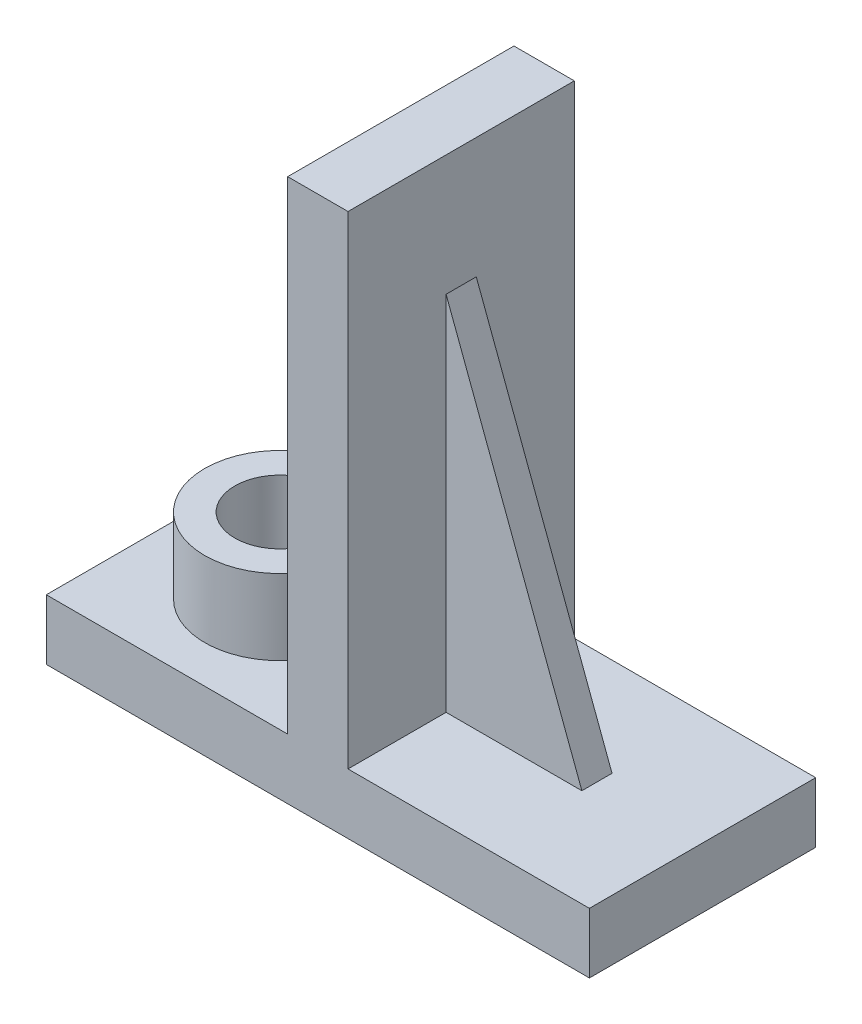
ISO-10303-21;
HEADER;
FILE_DESCRIPTION(('STEP AP214'),'2;1');
FILE_NAME('part.step','',(''),(''),'','','');
FILE_SCHEMA(('AUTOMOTIVE_DESIGN { 1 0 10303 214 1 1 1 1 }'));
ENDSEC;
DATA;
#1=APPLICATION_CONTEXT('core data for automotive mechanical design processes');
#2=APPLICATION_PROTOCOL_DEFINITION('international standard','automotive_design',2000,#1);
#3=PRODUCT_CONTEXT('',#1,'mechanical');
#4=PRODUCT('Part','Part','',(#3));
#5=PRODUCT_RELATED_PRODUCT_CATEGORY('part','',(#4));
#6=PRODUCT_DEFINITION_FORMATION('','',#4);
#7=PRODUCT_DEFINITION_CONTEXT('part definition',#1,'design');
#8=PRODUCT_DEFINITION('design','',#6,#7);
#9=PRODUCT_DEFINITION_SHAPE('','',#8);
#10=(LENGTH_UNIT() NAMED_UNIT(*) SI_UNIT(.MILLI.,.METRE.));
#11=(NAMED_UNIT(*) PLANE_ANGLE_UNIT() SI_UNIT($,.RADIAN.));
#12=(NAMED_UNIT(*) SI_UNIT($,.STERADIAN.) SOLID_ANGLE_UNIT());
#13=UNCERTAINTY_MEASURE_WITH_UNIT(LENGTH_MEASURE(1.E-05),#10,'distance_accuracy_value','');
#14=(GEOMETRIC_REPRESENTATION_CONTEXT(3) GLOBAL_UNCERTAINTY_ASSIGNED_CONTEXT((#13)) GLOBAL_UNIT_ASSIGNED_CONTEXT((#10,
#11,#12)) REPRESENTATION_CONTEXT('',''));
#15=CARTESIAN_POINT('',(0.,0.,0.));
#16=DIRECTION('',(0.,0.,1.));
#17=DIRECTION('',(1.,0.,0.));
#18=AXIS2_PLACEMENT_3D('',#15,#16,#17);
#19=CARTESIAN_POINT('',(36.,8.,15.));
#20=DIRECTION('',(0.,-1.,0.));
#21=DIRECTION('',(0.,0.,-1.));
#22=AXIS2_PLACEMENT_3D('',#19,#20,#21);
#23=PLANE('',#22);
#24=DIRECTION('',(1.,0.,0.));
#25=VECTOR('',#24,1.);
#26=CARTESIAN_POINT('',(22.,8.,2.));
#27=LINE('',#26,#25);
#28=CARTESIAN_POINT('',(4.,8.,2.));
#29=VERTEX_POINT('',#28);
#30=CARTESIAN_POINT('',(22.,8.,2.));
#31=VERTEX_POINT('',#30);
#32=EDGE_CURVE('E241',#29,#31,#27,.T.);
#33=ORIENTED_EDGE('',*,*,#32,.F.);
#34=DIRECTION('',(0.,0.,-1.));
#35=VECTOR('',#34,1.);
#36=CARTESIAN_POINT('',(4.,8.,15.));
#37=LINE('',#36,#35);
#38=CARTESIAN_POINT('',(4.,8.,15.));
#39=VERTEX_POINT('',#38);
#40=EDGE_CURVE('E187',#39,#29,#37,.T.);
#41=ORIENTED_EDGE('',*,*,#40,.F.);
#42=DIRECTION('',(-1.,0.,0.));
#43=VECTOR('',#42,1.);
#44=CARTESIAN_POINT('',(36.,8.,15.));
#45=LINE('',#44,#43);
#46=CARTESIAN_POINT('',(36.,8.,15.));
#47=VERTEX_POINT('',#46);
#48=EDGE_CURVE('E218',#47,#39,#45,.T.);
#49=ORIENTED_EDGE('',*,*,#48,.F.);
#50=DIRECTION('',(0.,0.,-1.));
#51=VECTOR('',#50,1.);
#52=CARTESIAN_POINT('',(36.,8.,15.));
#53=LINE('',#52,#51);
#54=CARTESIAN_POINT('',(36.,8.,-15.));
#55=VERTEX_POINT('',#54);
#56=EDGE_CURVE('E191',#47,#55,#53,.T.);
#57=ORIENTED_EDGE('',*,*,#56,.T.);
#58=DIRECTION('',(-1.,0.,0.));
#59=VECTOR('',#58,1.);
#60=CARTESIAN_POINT('',(36.,8.,-15.));
#61=LINE('',#60,#59);
#62=CARTESIAN_POINT('',(4.,8.,-15.));
#63=VERTEX_POINT('',#62);
#64=EDGE_CURVE('E165',#55,#63,#61,.T.);
#65=ORIENTED_EDGE('',*,*,#64,.T.);
#66=CARTESIAN_POINT('',(4.,8.,-2.));
#67=VERTEX_POINT('',#66);
#68=EDGE_CURVE('E186',#67,#63,#37,.T.);
#69=ORIENTED_EDGE('',*,*,#68,.F.);
#70=DIRECTION('',(1.,0.,0.));
#71=VECTOR('',#70,1.);
#72=CARTESIAN_POINT('',(22.,8.,-2.));
#73=LINE('',#72,#71);
#74=CARTESIAN_POINT('',(22.,8.,-2.));
#75=VERTEX_POINT('',#74);
#76=EDGE_CURVE('E55',#67,#75,#73,.T.);
#77=ORIENTED_EDGE('',*,*,#76,.T.);
#78=DIRECTION('',(0.,0.,-1.));
#79=VECTOR('',#78,1.);
#80=CARTESIAN_POINT('',(22.,8.,2.));
#81=LINE('',#80,#79);
#82=EDGE_CURVE('E159',#31,#75,#81,.T.);
#83=ORIENTED_EDGE('',*,*,#82,.F.);
#84=EDGE_LOOP('',(#33,#41,#49,#57,#65,#69,#77,#83));
#85=FACE_BOUND('',#84,.T.);
#86=ADVANCED_FACE('F39',(#85),#23,.F.);
#87=CARTESIAN_POINT('',(4.,8.,15.));
#88=DIRECTION('',(-1.,0.,0.));
#89=DIRECTION('',(0.,-1.,0.));
#90=AXIS2_PLACEMENT_3D('',#87,#88,#89);
#91=PLANE('',#90);
#92=DIRECTION('',(0.,-1.,0.));
#93=VECTOR('',#92,1.);
#94=CARTESIAN_POINT('',(4.,8.,2.));
#95=LINE('',#94,#93);
#96=CARTESIAN_POINT('',(4.,56.,2.));
#97=VERTEX_POINT('',#96);
#98=EDGE_CURVE('E237',#97,#29,#95,.T.);
#99=ORIENTED_EDGE('',*,*,#98,.F.);
#100=DIRECTION('',(0.,0.,-1.));
#101=VECTOR('',#100,1.);
#102=CARTESIAN_POINT('',(4.,56.,2.));
#103=LINE('',#102,#101);
#104=CARTESIAN_POINT('',(4.,56.,-2.));
#105=VERTEX_POINT('',#104);
#106=EDGE_CURVE('E233',#97,#105,#103,.T.);
#107=ORIENTED_EDGE('',*,*,#106,.T.);
#108=DIRECTION('',(0.,-1.,0.));
#109=VECTOR('',#108,1.);
#110=CARTESIAN_POINT('',(4.,8.,-2.));
#111=LINE('',#110,#109);
#112=EDGE_CURVE('E238',#105,#67,#111,.T.);
#113=ORIENTED_EDGE('',*,*,#112,.T.);
#114=ORIENTED_EDGE('',*,*,#68,.T.);
#115=DIRECTION('',(0.,1.,0.));
#116=VECTOR('',#115,1.);
#117=CARTESIAN_POINT('',(4.,8.,-15.));
#118=LINE('',#117,#116);
#119=CARTESIAN_POINT('',(4.,72.,-15.));
#120=VERTEX_POINT('',#119);
#121=EDGE_CURVE('E169',#63,#120,#118,.T.);
#122=ORIENTED_EDGE('',*,*,#121,.T.);
#123=DIRECTION('',(0.,0.,-1.));
#124=VECTOR('',#123,1.);
#125=CARTESIAN_POINT('',(4.,72.,15.));
#126=LINE('',#125,#124);
#127=CARTESIAN_POINT('',(4.,72.,15.));
#128=VERTEX_POINT('',#127);
#129=EDGE_CURVE('E143',#128,#120,#126,.T.);
#130=ORIENTED_EDGE('',*,*,#129,.F.);
#131=DIRECTION('',(0.,1.,0.));
#132=VECTOR('',#131,1.);
#133=CARTESIAN_POINT('',(4.,8.,15.));
#134=LINE('',#133,#132);
#135=EDGE_CURVE('E129',#39,#128,#134,.T.);
#136=ORIENTED_EDGE('',*,*,#135,.F.);
#137=ORIENTED_EDGE('',*,*,#40,.T.);
#138=EDGE_LOOP('',(#99,#107,#113,#114,#122,#130,#136,#137));
#139=FACE_BOUND('',#138,.T.);
#140=ADVANCED_FACE('F280',(#139),#91,.F.);
#141=CARTESIAN_POINT('',(-36.,8.,15.));
#142=DIRECTION('',(1.,0.,0.));
#143=DIRECTION('',(0.,0.,-1.));
#144=AXIS2_PLACEMENT_3D('',#141,#142,#143);
#145=PLANE('',#144);
#146=DIRECTION('',(0.,-1.,0.));
#147=VECTOR('',#146,1.);
#148=CARTESIAN_POINT('',(-36.,8.,-15.));
#149=LINE('',#148,#147);
#150=CARTESIAN_POINT('',(-36.,8.,-15.));
#151=VERTEX_POINT('',#150);
#152=CARTESIAN_POINT('',(-36.,0.,-15.));
#153=VERTEX_POINT('',#152);
#154=EDGE_CURVE('E154',#151,#153,#149,.T.);
#155=ORIENTED_EDGE('',*,*,#154,.T.);
#156=DIRECTION('',(0.,0.,-1.));
#157=VECTOR('',#156,1.);
#158=CARTESIAN_POINT('',(-36.,0.,15.));
#159=LINE('',#158,#157);
#160=CARTESIAN_POINT('',(-36.,0.,15.));
#161=VERTEX_POINT('',#160);
#162=EDGE_CURVE('E48',#161,#153,#159,.T.);
#163=ORIENTED_EDGE('',*,*,#162,.F.);
#164=DIRECTION('',(0.,-1.,0.));
#165=VECTOR('',#164,1.);
#166=CARTESIAN_POINT('',(-36.,8.,15.));
#167=LINE('',#166,#165);
#168=CARTESIAN_POINT('',(-36.,8.,15.));
#169=VERTEX_POINT('',#168);
#170=EDGE_CURVE('E179',#169,#161,#167,.T.);
#171=ORIENTED_EDGE('',*,*,#170,.F.);
#172=DIRECTION('',(0.,0.,-1.));
#173=VECTOR('',#172,1.);
#174=CARTESIAN_POINT('',(-36.,8.,15.));
#175=LINE('',#174,#173);
#176=EDGE_CURVE('E150',#169,#151,#175,.T.);
#177=ORIENTED_EDGE('',*,*,#176,.T.);
#178=EDGE_LOOP('',(#155,#163,#171,#177));
#179=FACE_BOUND('',#178,.T.);
#180=ADVANCED_FACE('F41',(#179),#145,.F.);
#181=CARTESIAN_POINT('',(36.,0.,15.));
#182=DIRECTION('',(0.,1.,0.));
#183=DIRECTION('',(0.,0.,1.));
#184=AXIS2_PLACEMENT_3D('',#181,#182,#183);
#185=PLANE('',#184);
#186=CARTESIAN_POINT('',(-20.,0.,0.));
#187=DIRECTION('',(0.,-1.,0.));
#188=DIRECTION('',(0.,0.,-1.));
#189=AXIS2_PLACEMENT_3D('',#186,#187,#188);
#190=CIRCLE('',#189,6.);
#191=CARTESIAN_POINT('',(-20.,0.,-6.));
#192=VERTEX_POINT('',#191);
#193=EDGE_CURVE('E266',#192,#192,#190,.T.);
#194=ORIENTED_EDGE('',*,*,#193,.F.);
#195=EDGE_LOOP('',(#194));
#196=FACE_BOUND('',#195,.T.);
#197=DIRECTION('',(1.,0.,0.));
#198=VECTOR('',#197,1.);
#199=CARTESIAN_POINT('',(36.,0.,-15.));
#200=LINE('',#199,#198);
#201=CARTESIAN_POINT('',(36.,0.,-15.));
#202=VERTEX_POINT('',#201);
#203=EDGE_CURVE('E158',#153,#202,#200,.T.);
#204=ORIENTED_EDGE('',*,*,#203,.T.);
#205=DIRECTION('',(0.,0.,-1.));
#206=VECTOR('',#205,1.);
#207=CARTESIAN_POINT('',(36.,0.,15.));
#208=LINE('',#207,#206);
#209=CARTESIAN_POINT('',(36.,0.,15.));
#210=VERTEX_POINT('',#209);
#211=EDGE_CURVE('E195',#210,#202,#208,.T.);
#212=ORIENTED_EDGE('',*,*,#211,.F.);
#213=DIRECTION('',(1.,0.,0.));
#214=VECTOR('',#213,1.);
#215=CARTESIAN_POINT('',(36.,0.,15.));
#216=LINE('',#215,#214);
#217=EDGE_CURVE('E106',#161,#210,#216,.T.);
#218=ORIENTED_EDGE('',*,*,#217,.F.);
#219=ORIENTED_EDGE('',*,*,#162,.T.);
#220=EDGE_LOOP('',(#204,#212,#218,#219));
#221=FACE_BOUND('',#220,.T.);
#222=ADVANCED_FACE('F200',(#196,#221),#185,.F.);
#223=CARTESIAN_POINT('',(36.,8.,15.));
#224=DIRECTION('',(-1.,0.,0.));
#225=DIRECTION('',(0.,0.,1.));
#226=AXIS2_PLACEMENT_3D('',#223,#224,#225);
#227=PLANE('',#226);
#228=DIRECTION('',(0.,1.,0.));
#229=VECTOR('',#228,1.);
#230=CARTESIAN_POINT('',(36.,8.,-15.));
#231=LINE('',#230,#229);
#232=EDGE_CURVE('E162',#202,#55,#231,.T.);
#233=ORIENTED_EDGE('',*,*,#232,.T.);
#234=ORIENTED_EDGE('',*,*,#56,.F.);
#235=DIRECTION('',(0.,1.,0.));
#236=VECTOR('',#235,1.);
#237=CARTESIAN_POINT('',(36.,8.,15.));
#238=LINE('',#237,#236);
#239=EDGE_CURVE('E220',#210,#47,#238,.T.);
#240=ORIENTED_EDGE('',*,*,#239,.F.);
#241=ORIENTED_EDGE('',*,*,#211,.T.);
#242=EDGE_LOOP('',(#233,#234,#240,#241));
#243=FACE_BOUND('',#242,.T.);
#244=ADVANCED_FACE('F211',(#243),#227,.F.);
#245=CARTESIAN_POINT('',(-4.,72.,15.));
#246=DIRECTION('',(0.,-1.,0.));
#247=DIRECTION('',(0.,0.,-1.));
#248=AXIS2_PLACEMENT_3D('',#245,#246,#247);
#249=PLANE('',#248);
#250=DIRECTION('',(-1.,0.,0.));
#251=VECTOR('',#250,1.);
#252=CARTESIAN_POINT('',(-4.,72.,-15.));
#253=LINE('',#252,#251);
#254=CARTESIAN_POINT('',(-4.,72.,-15.));
#255=VERTEX_POINT('',#254);
#256=EDGE_CURVE('E139',#120,#255,#253,.T.);
#257=ORIENTED_EDGE('',*,*,#256,.T.);
#258=DIRECTION('',(0.,0.,-1.));
#259=VECTOR('',#258,1.);
#260=CARTESIAN_POINT('',(-4.,72.,15.));
#261=LINE('',#260,#259);
#262=CARTESIAN_POINT('',(-4.,72.,15.));
#263=VERTEX_POINT('',#262);
#264=EDGE_CURVE('E136',#263,#255,#261,.T.);
#265=ORIENTED_EDGE('',*,*,#264,.F.);
#266=DIRECTION('',(-1.,0.,0.));
#267=VECTOR('',#266,1.);
#268=CARTESIAN_POINT('',(-4.,72.,15.));
#269=LINE('',#268,#267);
#270=EDGE_CURVE('E122',#128,#263,#269,.T.);
#271=ORIENTED_EDGE('',*,*,#270,.F.);
#272=ORIENTED_EDGE('',*,*,#129,.T.);
#273=EDGE_LOOP('',(#257,#265,#271,#272));
#274=FACE_BOUND('',#273,.T.);
#275=ADVANCED_FACE('F137',(#274),#249,.F.);
#276=CARTESIAN_POINT('',(-4.,8.,15.));
#277=DIRECTION('',(1.,0.,0.));
#278=DIRECTION('',(0.,0.,-1.));
#279=AXIS2_PLACEMENT_3D('',#276,#277,#278);
#280=PLANE('',#279);
#281=DIRECTION('',(0.,-1.,0.));
#282=VECTOR('',#281,1.);
#283=CARTESIAN_POINT('',(-4.,8.,-15.));
#284=LINE('',#283,#282);
#285=CARTESIAN_POINT('',(-4.,8.,-15.));
#286=VERTEX_POINT('',#285);
#287=EDGE_CURVE('E174',#255,#286,#284,.T.);
#288=ORIENTED_EDGE('',*,*,#287,.T.);
#289=DIRECTION('',(0.,0.,-1.));
#290=VECTOR('',#289,1.);
#291=CARTESIAN_POINT('',(-4.,8.,15.));
#292=LINE('',#291,#290);
#293=CARTESIAN_POINT('',(-4.,8.,15.));
#294=VERTEX_POINT('',#293);
#295=EDGE_CURVE('E144',#294,#286,#292,.T.);
#296=ORIENTED_EDGE('',*,*,#295,.F.);
#297=DIRECTION('',(0.,-1.,0.));
#298=VECTOR('',#297,1.);
#299=CARTESIAN_POINT('',(-4.,8.,15.));
#300=LINE('',#299,#298);
#301=EDGE_CURVE('E126',#263,#294,#300,.T.);
#302=ORIENTED_EDGE('',*,*,#301,.F.);
#303=ORIENTED_EDGE('',*,*,#264,.T.);
#304=EDGE_LOOP('',(#288,#296,#302,#303));
#305=FACE_BOUND('',#304,.T.);
#306=ADVANCED_FACE('F146',(#305),#280,.F.);
#307=CARTESIAN_POINT('',(-4.,8.,15.));
#308=DIRECTION('',(0.,-1.,0.));
#309=DIRECTION('',(0.,0.,-1.));
#310=AXIS2_PLACEMENT_3D('',#307,#308,#309);
#311=PLANE('',#310);
#312=CARTESIAN_POINT('',(-20.,8.,0.));
#313=DIRECTION('',(0.,-1.,0.));
#314=DIRECTION('',(0.,0.,-1.));
#315=AXIS2_PLACEMENT_3D('',#312,#313,#314);
#316=CIRCLE('',#315,10.);
#317=CARTESIAN_POINT('',(-20.,8.,-10.));
#318=VERTEX_POINT('',#317);
#319=EDGE_CURVE('E11',#318,#318,#316,.F.);
#320=ORIENTED_EDGE('',*,*,#319,.F.);
#321=EDGE_LOOP('',(#320));
#322=FACE_BOUND('',#321,.T.);
#323=DIRECTION('',(-1.,0.,0.));
#324=VECTOR('',#323,1.);
#325=CARTESIAN_POINT('',(-4.,8.,-15.));
#326=LINE('',#325,#324);
#327=EDGE_CURVE('E97',#286,#151,#326,.T.);
#328=ORIENTED_EDGE('',*,*,#327,.T.);
#329=ORIENTED_EDGE('',*,*,#176,.F.);
#330=DIRECTION('',(-1.,0.,0.));
#331=VECTOR('',#330,1.);
#332=CARTESIAN_POINT('',(-4.,8.,15.));
#333=LINE('',#332,#331);
#334=EDGE_CURVE('E64',#294,#169,#333,.T.);
#335=ORIENTED_EDGE('',*,*,#334,.F.);
#336=ORIENTED_EDGE('',*,*,#295,.T.);
#337=EDGE_LOOP('',(#328,#329,#335,#336));
#338=FACE_BOUND('',#337,.T.);
#339=ADVANCED_FACE('F293',(#322,#338),#311,.F.);
#340=CARTESIAN_POINT('',(0.,0.,15.));
#341=DIRECTION('',(0.,0.,-1.));
#342=DIRECTION('',(-1.,0.,0.));
#343=AXIS2_PLACEMENT_3D('',#340,#341,#342);
#344=PLANE('',#343);
#345=ORIENTED_EDGE('',*,*,#170,.T.);
#346=ORIENTED_EDGE('',*,*,#217,.T.);
#347=ORIENTED_EDGE('',*,*,#239,.T.);
#348=ORIENTED_EDGE('',*,*,#48,.T.);
#349=ORIENTED_EDGE('',*,*,#135,.T.);
#350=ORIENTED_EDGE('',*,*,#270,.T.);
#351=ORIENTED_EDGE('',*,*,#301,.T.);
#352=ORIENTED_EDGE('',*,*,#334,.T.);
#353=EDGE_LOOP('',(#345,#346,#347,#348,#349,#350,#351,#352));
#354=FACE_BOUND('',#353,.T.);
#355=ADVANCED_FACE('F124',(#354),#344,.F.);
#356=CARTESIAN_POINT('',(0.,0.,-15.));
#357=DIRECTION('',(0.,0.,-1.));
#358=DIRECTION('',(-1.,0.,0.));
#359=AXIS2_PLACEMENT_3D('',#356,#357,#358);
#360=PLANE('',#359);
#361=ORIENTED_EDGE('',*,*,#154,.F.);
#362=ORIENTED_EDGE('',*,*,#327,.F.);
#363=ORIENTED_EDGE('',*,*,#287,.F.);
#364=ORIENTED_EDGE('',*,*,#256,.F.);
#365=ORIENTED_EDGE('',*,*,#121,.F.);
#366=ORIENTED_EDGE('',*,*,#64,.F.);
#367=ORIENTED_EDGE('',*,*,#232,.F.);
#368=ORIENTED_EDGE('',*,*,#203,.F.);
#369=EDGE_LOOP('',(#361,#362,#363,#364,#365,#366,#367,#368));
#370=FACE_BOUND('',#369,.T.);
#371=ADVANCED_FACE('F205',(#370),#360,.T.);
#372=CARTESIAN_POINT('',(4.,56.,2.));
#373=DIRECTION('',(-0.936329177569045,-0.351123441588392,0.));
#374=DIRECTION('',(0.351123441588392,-0.936329177569044,0.));
#375=AXIS2_PLACEMENT_3D('',#372,#373,#374);
#376=PLANE('',#375);
#377=DIRECTION('',(-0.351123441588392,0.936329177569045,0.));
#378=VECTOR('',#377,1.);
#379=CARTESIAN_POINT('',(4.,56.,-2.));
#380=LINE('',#379,#378);
#381=EDGE_CURVE('E242',#75,#105,#380,.T.);
#382=ORIENTED_EDGE('',*,*,#381,.T.);
#383=ORIENTED_EDGE('',*,*,#106,.F.);
#384=DIRECTION('',(-0.351123441588392,0.936329177569045,0.));
#385=VECTOR('',#384,1.);
#386=CARTESIAN_POINT('',(4.,56.,2.));
#387=LINE('',#386,#385);
#388=EDGE_CURVE('E252',#31,#97,#387,.T.);
#389=ORIENTED_EDGE('',*,*,#388,.F.);
#390=ORIENTED_EDGE('',*,*,#82,.T.);
#391=EDGE_LOOP('',(#382,#383,#389,#390));
#392=FACE_BOUND('',#391,.T.);
#393=ADVANCED_FACE('F299',(#392),#376,.F.);
#394=CARTESIAN_POINT('',(0.,0.,2.));
#395=DIRECTION('',(0.,0.,-1.));
#396=DIRECTION('',(-1.,0.,0.));
#397=AXIS2_PLACEMENT_3D('',#394,#395,#396);
#398=PLANE('',#397);
#399=ORIENTED_EDGE('',*,*,#32,.T.);
#400=ORIENTED_EDGE('',*,*,#388,.T.);
#401=ORIENTED_EDGE('',*,*,#98,.T.);
#402=EDGE_LOOP('',(#399,#400,#401));
#403=FACE_BOUND('',#402,.T.);
#404=ADVANCED_FACE('F304',(#403),#398,.F.);
#405=CARTESIAN_POINT('',(0.,0.,-2.));
#406=DIRECTION('',(0.,0.,-1.));
#407=DIRECTION('',(-1.,0.,0.));
#408=AXIS2_PLACEMENT_3D('',#405,#406,#407);
#409=PLANE('',#408);
#410=ORIENTED_EDGE('',*,*,#76,.F.);
#411=ORIENTED_EDGE('',*,*,#112,.F.);
#412=ORIENTED_EDGE('',*,*,#381,.F.);
#413=EDGE_LOOP('',(#410,#411,#412));
#414=FACE_BOUND('',#413,.T.);
#415=ADVANCED_FACE('F306',(#414),#409,.T.);
#416=CARTESIAN_POINT('',(-20.,18.,0.));
#417=DIRECTION('',(0.,1.,0.));
#418=DIRECTION('',(0.,0.,1.));
#419=AXIS2_PLACEMENT_3D('',#416,#417,#418);
#420=PLANE('',#419);
#421=CARTESIAN_POINT('',(-20.,18.,0.));
#422=DIRECTION('',(0.,1.,0.));
#423=DIRECTION('',(0.,0.,1.));
#424=AXIS2_PLACEMENT_3D('',#421,#422,#423);
#425=CIRCLE('',#424,10.);
#426=CARTESIAN_POINT('',(-20.,18.,10.));
#427=VERTEX_POINT('',#426);
#428=EDGE_CURVE('E248',#427,#427,#425,.T.);
#429=ORIENTED_EDGE('',*,*,#428,.T.);
#430=EDGE_LOOP('',(#429));
#431=FACE_BOUND('',#430,.T.);
#432=CARTESIAN_POINT('',(-20.,18.,0.));
#433=DIRECTION('',(0.,1.,0.));
#434=DIRECTION('',(0.,0.,1.));
#435=AXIS2_PLACEMENT_3D('',#432,#433,#434);
#436=CIRCLE('',#435,6.);
#437=CARTESIAN_POINT('',(-20.,18.,6.));
#438=VERTEX_POINT('',#437);
#439=EDGE_CURVE('E262',#438,#438,#436,.T.);
#440=ORIENTED_EDGE('',*,*,#439,.F.);
#441=EDGE_LOOP('',(#440));
#442=FACE_BOUND('',#441,.T.);
#443=ADVANCED_FACE('F309',(#431,#442),#420,.T.);
#444=CARTESIAN_POINT('',(-20.,18.,0.));
#445=DIRECTION('',(0.,-1.,0.));
#446=DIRECTION('',(0.,0.,-1.));
#447=AXIS2_PLACEMENT_3D('',#444,#445,#446);
#448=CYLINDRICAL_SURFACE('',#447,10.);
#449=ORIENTED_EDGE('',*,*,#428,.F.);
#450=EDGE_LOOP('',(#449));
#451=FACE_BOUND('',#450,.T.);
#452=ORIENTED_EDGE('',*,*,#319,.T.);
#453=EDGE_LOOP('',(#452));
#454=FACE_BOUND('',#453,.T.);
#455=ADVANCED_FACE('F313',(#451,#454),#448,.T.);
#456=CARTESIAN_POINT('',(-20.,18.,0.));
#457=DIRECTION('',(0.,-1.,0.));
#458=DIRECTION('',(0.,0.,-1.));
#459=AXIS2_PLACEMENT_3D('',#456,#457,#458);
#460=CYLINDRICAL_SURFACE('',#459,6.);
#461=ORIENTED_EDGE('',*,*,#193,.T.);
#462=EDGE_LOOP('',(#461));
#463=FACE_BOUND('',#462,.T.);
#464=ORIENTED_EDGE('',*,*,#439,.T.);
#465=EDGE_LOOP('',(#464));
#466=FACE_BOUND('',#465,.T.);
#467=ADVANCED_FACE('F271',(#463,#466),#460,.F.);
#468=CLOSED_SHELL('',(#86,#140,#180,#222,#244,#275,#306,#339,#355,#371,#393,#404,#415,#443,#455,#467));
#469=MANIFOLD_SOLID_BREP('B2',#468);
#470=ADVANCED_BREP_SHAPE_REPRESENTATION('',(#18,#469),#14);
#471=SHAPE_DEFINITION_REPRESENTATION(#9,#470);
ENDSEC;
END-ISO-10303-21;
